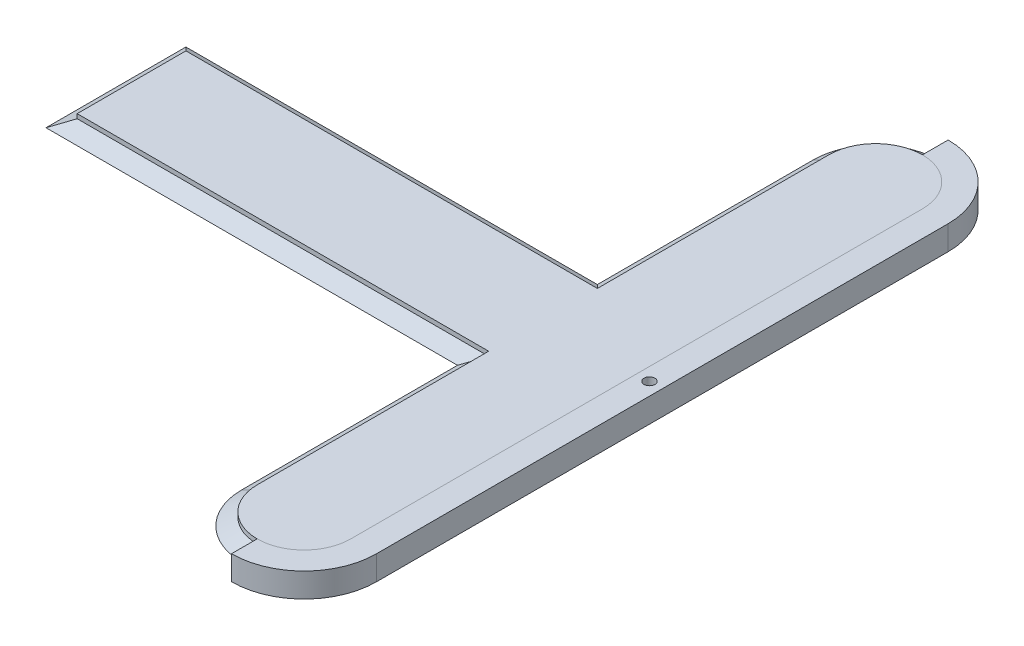
ISO-10303-21;
HEADER;
FILE_DESCRIPTION(('STEP AP214'),'2;1');
FILE_NAME('part.step','',(''),(''),'','','');
FILE_SCHEMA(('AUTOMOTIVE_DESIGN { 1 0 10303 214 1 1 1 1 }'));
ENDSEC;
DATA;
#1=APPLICATION_CONTEXT('core data for automotive mechanical design processes');
#2=APPLICATION_PROTOCOL_DEFINITION('international standard','automotive_design',2000,#1);
#3=PRODUCT_CONTEXT('',#1,'mechanical');
#4=PRODUCT('Part','Part','',(#3));
#5=PRODUCT_RELATED_PRODUCT_CATEGORY('part','',(#4));
#6=PRODUCT_DEFINITION_FORMATION('','',#4);
#7=PRODUCT_DEFINITION_CONTEXT('part definition',#1,'design');
#8=PRODUCT_DEFINITION('design','',#6,#7);
#9=PRODUCT_DEFINITION_SHAPE('','',#8);
#10=(LENGTH_UNIT() NAMED_UNIT(*) SI_UNIT(.MILLI.,.METRE.));
#11=(NAMED_UNIT(*) PLANE_ANGLE_UNIT() SI_UNIT($,.RADIAN.));
#12=(NAMED_UNIT(*) SI_UNIT($,.STERADIAN.) SOLID_ANGLE_UNIT());
#13=UNCERTAINTY_MEASURE_WITH_UNIT(LENGTH_MEASURE(1.E-05),#10,'distance_accuracy_value','');
#14=(GEOMETRIC_REPRESENTATION_CONTEXT(3) GLOBAL_UNCERTAINTY_ASSIGNED_CONTEXT((#13)) GLOBAL_UNIT_ASSIGNED_CONTEXT((#10,
#11,#12)) REPRESENTATION_CONTEXT('',''));
#15=CARTESIAN_POINT('',(0.,0.,0.));
#16=DIRECTION('',(0.,0.,1.));
#17=DIRECTION('',(1.,0.,0.));
#18=AXIS2_PLACEMENT_3D('',#15,#16,#17);
#19=CARTESIAN_POINT('',(113.157,-177.860840145929,70.5715536280061));
#20=DIRECTION('',(0.,1.,0.));
#21=DIRECTION('',(0.,0.,1.));
#22=AXIS2_PLACEMENT_3D('',#19,#20,#21);
#23=CYLINDRICAL_SURFACE('',#22,17.9070000000001);
#24=CARTESIAN_POINT('',(113.157,0.,70.5715536280061));
#25=DIRECTION('',(0.,1.,0.));
#26=DIRECTION('',(0.,0.,1.));
#27=AXIS2_PLACEMENT_3D('',#24,#25,#26);
#28=CIRCLE('',#27,17.9070000000001);
#29=CARTESIAN_POINT('',(131.064,0.,70.5715536280061));
#30=VERTEX_POINT('',#29);
#31=CARTESIAN_POINT('',(113.157,0.,88.4785536280062));
#32=VERTEX_POINT('',#31);
#33=EDGE_CURVE('E64',#30,#32,#28,.F.);
#34=ORIENTED_EDGE('',*,*,#33,.F.);
#35=DIRECTION('',(0.,1.,0.));
#36=VECTOR('',#35,1.);
#37=CARTESIAN_POINT('',(131.064,-177.860840145929,70.5715536280061));
#38=LINE('',#37,#36);
#39=CARTESIAN_POINT('',(131.064,6.,70.5715536280061));
#40=VERTEX_POINT('',#39);
#41=EDGE_CURVE('E138',#30,#40,#38,.T.);
#42=ORIENTED_EDGE('',*,*,#41,.T.);
#43=CARTESIAN_POINT('',(113.157,6.,70.5715536280061));
#44=DIRECTION('',(0.,1.,0.));
#45=DIRECTION('',(0.,0.,1.));
#46=AXIS2_PLACEMENT_3D('',#43,#44,#45);
#47=CIRCLE('',#46,17.9070000000001);
#48=CARTESIAN_POINT('',(113.157,6.,88.4785536280062));
#49=VERTEX_POINT('',#48);
#50=EDGE_CURVE('E167',#49,#40,#47,.T.);
#51=ORIENTED_EDGE('',*,*,#50,.F.);
#52=DIRECTION('',(0.,1.,0.));
#53=VECTOR('',#52,1.);
#54=CARTESIAN_POINT('',(113.157,-177.860840145929,88.4785536280062));
#55=LINE('',#54,#53);
#56=EDGE_CURVE('E124',#32,#49,#55,.T.);
#57=ORIENTED_EDGE('',*,*,#56,.F.);
#58=EDGE_LOOP('',(#34,#42,#51,#57));
#59=FACE_BOUND('',#58,.T.);
#60=ADVANCED_FACE('F56',(#59),#23,.T.);
#61=CARTESIAN_POINT('',(113.157,-177.860840145929,82.1285536280061));
#62=DIRECTION('',(-1.,0.,0.));
#63=DIRECTION('',(0.,0.,1.));
#64=AXIS2_PLACEMENT_3D('',#61,#62,#63);
#65=PLANE('',#64);
#66=DIRECTION('',(0.,0.,-1.));
#67=VECTOR('',#66,1.);
#68=CARTESIAN_POINT('',(113.157,0.,82.1285536280061));
#69=LINE('',#68,#67);
#70=CARTESIAN_POINT('',(113.157,0.,82.1285536280061));
#71=VERTEX_POINT('',#70);
#72=EDGE_CURVE('E101',#32,#71,#69,.T.);
#73=ORIENTED_EDGE('',*,*,#72,.F.);
#74=ORIENTED_EDGE('',*,*,#56,.T.);
#75=DIRECTION('',(0.,0.,1.));
#76=VECTOR('',#75,1.);
#77=CARTESIAN_POINT('',(113.157,6.,82.1285536280061));
#78=LINE('',#77,#76);
#79=CARTESIAN_POINT('',(113.157,6.,82.1285536280061));
#80=VERTEX_POINT('',#79);
#81=EDGE_CURVE('E140',#80,#49,#78,.T.);
#82=ORIENTED_EDGE('',*,*,#81,.F.);
#83=DIRECTION('',(0.,1.,0.));
#84=VECTOR('',#83,1.);
#85=CARTESIAN_POINT('',(113.157,-177.860840145929,82.1285536280061));
#86=LINE('',#85,#84);
#87=EDGE_CURVE('E122',#71,#80,#86,.T.);
#88=ORIENTED_EDGE('',*,*,#87,.F.);
#89=EDGE_LOOP('',(#73,#74,#82,#88));
#90=FACE_BOUND('',#89,.T.);
#91=ADVANCED_FACE('F192',(#90),#65,.T.);
#92=CARTESIAN_POINT('',(113.157,-177.860840145929,70.5715536280061));
#93=DIRECTION('',(0.,1.,0.));
#94=DIRECTION('',(0.,0.,1.));
#95=AXIS2_PLACEMENT_3D('',#92,#93,#94);
#96=CYLINDRICAL_SURFACE('',#95,11.557);
#97=CARTESIAN_POINT('',(113.157,0.,70.5715536280061));
#98=DIRECTION('',(0.,1.,0.));
#99=DIRECTION('',(0.,0.,1.));
#100=AXIS2_PLACEMENT_3D('',#97,#98,#99);
#101=CIRCLE('',#100,11.557);
#102=CARTESIAN_POINT('',(124.714,0.,70.5715536280061));
#103=VERTEX_POINT('',#102);
#104=EDGE_CURVE('E97',#71,#103,#101,.T.);
#105=ORIENTED_EDGE('',*,*,#104,.F.);
#106=ORIENTED_EDGE('',*,*,#87,.T.);
#107=CARTESIAN_POINT('',(113.157,6.,70.5715536280061));
#108=DIRECTION('',(0.,-1.,0.));
#109=DIRECTION('',(0.,0.,1.));
#110=AXIS2_PLACEMENT_3D('',#107,#108,#109);
#111=CIRCLE('',#110,11.557);
#112=CARTESIAN_POINT('',(124.714,6.,70.5715536280061));
#113=VERTEX_POINT('',#112);
#114=EDGE_CURVE('E120',#113,#80,#111,.T.);
#115=ORIENTED_EDGE('',*,*,#114,.F.);
#116=DIRECTION('',(0.,1.,0.));
#117=VECTOR('',#116,1.);
#118=CARTESIAN_POINT('',(124.714,-177.860840145929,70.5715536280061));
#119=LINE('',#118,#117);
#120=EDGE_CURVE('E113',#103,#113,#119,.T.);
#121=ORIENTED_EDGE('',*,*,#120,.F.);
#122=EDGE_LOOP('',(#105,#106,#115,#121));
#123=FACE_BOUND('',#122,.T.);
#124=ADVANCED_FACE('F118',(#123),#96,.F.);
#125=CARTESIAN_POINT('',(124.714,-177.860840145929,-70.571553628006));
#126=DIRECTION('',(-1.,0.,0.));
#127=DIRECTION('',(0.,0.,1.));
#128=AXIS2_PLACEMENT_3D('',#125,#126,#127);
#129=PLANE('',#128);
#130=DIRECTION('',(0.,0.,-1.));
#131=VECTOR('',#130,1.);
#132=CARTESIAN_POINT('',(124.714,0.,-70.571553628006));
#133=LINE('',#132,#131);
#134=CARTESIAN_POINT('',(124.714,0.,-70.571553628006));
#135=VERTEX_POINT('',#134);
#136=EDGE_CURVE('E100',#103,#135,#133,.T.);
#137=ORIENTED_EDGE('',*,*,#136,.F.);
#138=ORIENTED_EDGE('',*,*,#120,.T.);
#139=DIRECTION('',(0.,0.,1.));
#140=VECTOR('',#139,1.);
#141=CARTESIAN_POINT('',(124.714,6.,-70.571553628006));
#142=LINE('',#141,#140);
#143=CARTESIAN_POINT('',(124.714,6.,-70.571553628006));
#144=VERTEX_POINT('',#143);
#145=EDGE_CURVE('E151',#144,#113,#142,.T.);
#146=ORIENTED_EDGE('',*,*,#145,.F.);
#147=DIRECTION('',(0.,1.,0.));
#148=VECTOR('',#147,1.);
#149=CARTESIAN_POINT('',(124.714,-177.860840145929,-70.571553628006));
#150=LINE('',#149,#148);
#151=EDGE_CURVE('E116',#135,#144,#150,.T.);
#152=ORIENTED_EDGE('',*,*,#151,.F.);
#153=EDGE_LOOP('',(#137,#138,#146,#152));
#154=FACE_BOUND('',#153,.T.);
#155=ADVANCED_FACE('F110',(#154),#129,.T.);
#156=CARTESIAN_POINT('',(113.157,-177.860840145929,-70.571553628006));
#157=DIRECTION('',(0.,1.,0.));
#158=DIRECTION('',(0.,0.,1.));
#159=AXIS2_PLACEMENT_3D('',#156,#157,#158);
#160=CYLINDRICAL_SURFACE('',#159,11.557);
#161=CARTESIAN_POINT('',(113.157,0.,-70.571553628006));
#162=DIRECTION('',(0.,1.,0.));
#163=DIRECTION('',(0.,0.,1.));
#164=AXIS2_PLACEMENT_3D('',#161,#162,#163);
#165=CIRCLE('',#164,11.557);
#166=CARTESIAN_POINT('',(113.157,0.,-82.1285536280061));
#167=VERTEX_POINT('',#166);
#168=EDGE_CURVE('E77',#135,#167,#165,.T.);
#169=ORIENTED_EDGE('',*,*,#168,.F.);
#170=ORIENTED_EDGE('',*,*,#151,.T.);
#171=CARTESIAN_POINT('',(113.157,6.,-70.571553628006));
#172=DIRECTION('',(0.,-1.,0.));
#173=DIRECTION('',(0.,0.,1.));
#174=AXIS2_PLACEMENT_3D('',#171,#172,#173);
#175=CIRCLE('',#174,11.557);
#176=CARTESIAN_POINT('',(113.157,6.,-82.1285536280061));
#177=VERTEX_POINT('',#176);
#178=EDGE_CURVE('E178',#177,#144,#175,.T.);
#179=ORIENTED_EDGE('',*,*,#178,.F.);
#180=DIRECTION('',(0.,1.,0.));
#181=VECTOR('',#180,1.);
#182=CARTESIAN_POINT('',(113.157,-177.860840145929,-82.1285536280061));
#183=LINE('',#182,#181);
#184=EDGE_CURVE('E126',#167,#177,#183,.T.);
#185=ORIENTED_EDGE('',*,*,#184,.F.);
#186=EDGE_LOOP('',(#169,#170,#179,#185));
#187=FACE_BOUND('',#186,.T.);
#188=ADVANCED_FACE('F204',(#187),#160,.F.);
#189=CARTESIAN_POINT('',(113.157,-177.860840145929,-88.4785536280061));
#190=DIRECTION('',(-1.,0.,0.));
#191=DIRECTION('',(0.,0.,1.));
#192=AXIS2_PLACEMENT_3D('',#189,#190,#191);
#193=PLANE('',#192);
#194=DIRECTION('',(0.,0.,-1.));
#195=VECTOR('',#194,1.);
#196=CARTESIAN_POINT('',(113.157,0.,-88.4785536280061));
#197=LINE('',#196,#195);
#198=CARTESIAN_POINT('',(113.157,0.,-88.4785536280061));
#199=VERTEX_POINT('',#198);
#200=EDGE_CURVE('E71',#167,#199,#197,.T.);
#201=ORIENTED_EDGE('',*,*,#200,.F.);
#202=ORIENTED_EDGE('',*,*,#184,.T.);
#203=DIRECTION('',(0.,0.,1.));
#204=VECTOR('',#203,1.);
#205=CARTESIAN_POINT('',(113.157,6.,-88.4785536280061));
#206=LINE('',#205,#204);
#207=CARTESIAN_POINT('',(113.157,6.,-88.4785536280061));
#208=VERTEX_POINT('',#207);
#209=EDGE_CURVE('E175',#208,#177,#206,.T.);
#210=ORIENTED_EDGE('',*,*,#209,.F.);
#211=DIRECTION('',(0.,1.,0.));
#212=VECTOR('',#211,1.);
#213=CARTESIAN_POINT('',(113.157,-177.860840145929,-88.4785536280061));
#214=LINE('',#213,#212);
#215=EDGE_CURVE('E132',#199,#208,#214,.T.);
#216=ORIENTED_EDGE('',*,*,#215,.F.);
#217=EDGE_LOOP('',(#201,#202,#210,#216));
#218=FACE_BOUND('',#217,.T.);
#219=ADVANCED_FACE('F202',(#218),#193,.T.);
#220=CARTESIAN_POINT('',(113.157,-177.860840145929,-70.571553628006));
#221=DIRECTION('',(0.,1.,0.));
#222=DIRECTION('',(0.,0.,1.));
#223=AXIS2_PLACEMENT_3D('',#220,#221,#222);
#224=CYLINDRICAL_SURFACE('',#223,17.9070000000001);
#225=CARTESIAN_POINT('',(113.157,0.,-70.571553628006));
#226=DIRECTION('',(0.,1.,0.));
#227=DIRECTION('',(0.,0.,1.));
#228=AXIS2_PLACEMENT_3D('',#225,#226,#227);
#229=CIRCLE('',#228,17.9070000000001);
#230=CARTESIAN_POINT('',(131.064,0.,-70.571553628006));
#231=VERTEX_POINT('',#230);
#232=EDGE_CURVE('E155',#199,#231,#229,.F.);
#233=ORIENTED_EDGE('',*,*,#232,.F.);
#234=ORIENTED_EDGE('',*,*,#215,.T.);
#235=CARTESIAN_POINT('',(113.157,6.,-70.571553628006));
#236=DIRECTION('',(0.,1.,0.));
#237=DIRECTION('',(0.,0.,1.));
#238=AXIS2_PLACEMENT_3D('',#235,#236,#237);
#239=CIRCLE('',#238,17.9070000000001);
#240=CARTESIAN_POINT('',(131.064,6.,-70.571553628006));
#241=VERTEX_POINT('',#240);
#242=EDGE_CURVE('E172',#241,#208,#239,.T.);
#243=ORIENTED_EDGE('',*,*,#242,.F.);
#244=DIRECTION('',(0.,1.,0.));
#245=VECTOR('',#244,1.);
#246=CARTESIAN_POINT('',(131.064,-177.860840145929,-70.571553628006));
#247=LINE('',#246,#245);
#248=EDGE_CURVE('E135',#231,#241,#247,.T.);
#249=ORIENTED_EDGE('',*,*,#248,.F.);
#250=EDGE_LOOP('',(#233,#234,#243,#249));
#251=FACE_BOUND('',#250,.T.);
#252=ADVANCED_FACE('F200',(#251),#224,.T.);
#253=CARTESIAN_POINT('',(131.064,-177.860840145929,70.5715536280061));
#254=DIRECTION('',(1.,0.,0.));
#255=DIRECTION('',(0.,0.,-1.));
#256=AXIS2_PLACEMENT_3D('',#253,#254,#255);
#257=PLANE('',#256);
#258=DIRECTION('',(0.,0.,1.));
#259=VECTOR('',#258,1.);
#260=CARTESIAN_POINT('',(131.064,0.,70.5715536280061));
#261=LINE('',#260,#259);
#262=EDGE_CURVE('E12',#231,#30,#261,.T.);
#263=ORIENTED_EDGE('',*,*,#262,.F.);
#264=ORIENTED_EDGE('',*,*,#248,.T.);
#265=DIRECTION('',(0.,0.,-1.));
#266=VECTOR('',#265,1.);
#267=CARTESIAN_POINT('',(131.064,6.,70.5715536280061));
#268=LINE('',#267,#266);
#269=EDGE_CURVE('E169',#40,#241,#268,.T.);
#270=ORIENTED_EDGE('',*,*,#269,.F.);
#271=ORIENTED_EDGE('',*,*,#41,.F.);
#272=EDGE_LOOP('',(#263,#264,#270,#271));
#273=FACE_BOUND('',#272,.T.);
#274=ADVANCED_FACE('F225',(#273),#257,.T.);
#275=CARTESIAN_POINT('',(113.157,6.,70.5715536280061));
#276=DIRECTION('',(0.,1.,0.));
#277=DIRECTION('',(0.,0.,1.));
#278=AXIS2_PLACEMENT_3D('',#275,#276,#277);
#279=PLANE('',#278);
#280=CARTESIAN_POINT('',(127.889,6.,0.));
#281=DIRECTION('',(0.,1.,0.));
#282=DIRECTION('',(0.,0.,1.));
#283=AXIS2_PLACEMENT_3D('',#280,#281,#282);
#284=CIRCLE('',#283,1.34999999999998);
#285=CARTESIAN_POINT('',(127.889,6.,1.34999999999999));
#286=VERTEX_POINT('',#285);
#287=EDGE_CURVE('E162',#286,#286,#284,.T.);
#288=ORIENTED_EDGE('',*,*,#287,.F.);
#289=EDGE_LOOP('',(#288));
#290=FACE_BOUND('',#289,.T.);
#291=ORIENTED_EDGE('',*,*,#50,.T.);
#292=ORIENTED_EDGE('',*,*,#269,.T.);
#293=ORIENTED_EDGE('',*,*,#242,.T.);
#294=ORIENTED_EDGE('',*,*,#209,.T.);
#295=ORIENTED_EDGE('',*,*,#178,.T.);
#296=ORIENTED_EDGE('',*,*,#145,.T.);
#297=ORIENTED_EDGE('',*,*,#114,.T.);
#298=ORIENTED_EDGE('',*,*,#81,.T.);
#299=EDGE_LOOP('',(#291,#292,#293,#294,#295,#296,#297,#298));
#300=FACE_BOUND('',#299,.T.);
#301=ADVANCED_FACE('F180',(#290,#300),#279,.T.);
#302=CARTESIAN_POINT('',(113.157,0.,70.5715536280061));
#303=DIRECTION('',(0.,1.,0.));
#304=DIRECTION('',(0.,0.,1.));
#305=AXIS2_PLACEMENT_3D('',#302,#303,#304);
#306=PLANE('',#305);
#307=CARTESIAN_POINT('',(127.889,0.,0.));
#308=DIRECTION('',(0.,1.,0.));
#309=DIRECTION('',(0.,0.,1.));
#310=AXIS2_PLACEMENT_3D('',#307,#308,#309);
#311=CIRCLE('',#310,1.34999999999998);
#312=CARTESIAN_POINT('',(127.889,0.,1.34999999999999));
#313=VERTEX_POINT('',#312);
#314=EDGE_CURVE('E59',#313,#313,#311,.T.);
#315=ORIENTED_EDGE('',*,*,#314,.T.);
#316=EDGE_LOOP('',(#315));
#317=FACE_BOUND('',#316,.T.);
#318=ORIENTED_EDGE('',*,*,#33,.T.);
#319=ORIENTED_EDGE('',*,*,#72,.T.);
#320=ORIENTED_EDGE('',*,*,#104,.T.);
#321=ORIENTED_EDGE('',*,*,#136,.T.);
#322=ORIENTED_EDGE('',*,*,#168,.T.);
#323=ORIENTED_EDGE('',*,*,#200,.T.);
#324=ORIENTED_EDGE('',*,*,#232,.T.);
#325=ORIENTED_EDGE('',*,*,#262,.T.);
#326=EDGE_LOOP('',(#318,#319,#320,#321,#322,#323,#324,#325));
#327=FACE_BOUND('',#326,.T.);
#328=ADVANCED_FACE('F99',(#317,#327),#306,.F.);
#329=CARTESIAN_POINT('',(127.889,-11.78,0.));
#330=DIRECTION('',(0.,1.,0.));
#331=DIRECTION('',(0.,0.,1.));
#332=AXIS2_PLACEMENT_3D('',#329,#330,#331);
#333=CYLINDRICAL_SURFACE('',#332,1.34999999999998);
#334=ORIENTED_EDGE('',*,*,#287,.T.);
#335=EDGE_LOOP('',(#334));
#336=FACE_BOUND('',#335,.T.);
#337=ORIENTED_EDGE('',*,*,#314,.F.);
#338=EDGE_LOOP('',(#337));
#339=FACE_BOUND('',#338,.T.);
#340=ADVANCED_FACE('F229',(#336,#339),#333,.F.);
#341=CLOSED_SHELL('',(#60,#91,#124,#155,#188,#219,#252,#274,#301,#328,#340));
#342=MANIFOLD_SOLID_BREP('B2',#341);
#343=CARTESIAN_POINT('',(0.,6.,-13.4215536280061));
#344=DIRECTION('',(1.,0.,0.));
#345=DIRECTION('',(0.,0.,-1.));
#346=AXIS2_PLACEMENT_3D('',#343,#344,#345);
#347=PLANE('',#346);
#348=DIRECTION('',(0.,0.,-1.));
#349=VECTOR('',#348,1.);
#350=CARTESIAN_POINT('',(0.,4.91034304153466,17.7565536280061));
#351=LINE('',#350,#349);
#352=CARTESIAN_POINT('',(0.,4.91034304153466,13.4215536280061));
#353=VERTEX_POINT('',#352);
#354=CARTESIAN_POINT('',(0.,4.91034304153466,-13.4215536280061));
#355=VERTEX_POINT('',#354);
#356=EDGE_CURVE('E517',#353,#355,#351,.T.);
#357=ORIENTED_EDGE('',*,*,#356,.F.);
#358=DIRECTION('',(0.,-1.,0.));
#359=VECTOR('',#358,1.);
#360=CARTESIAN_POINT('',(0.,6.,13.4215536280061));
#361=LINE('',#360,#359);
#362=CARTESIAN_POINT('',(0.,6.,13.4215536280061));
#363=VERTEX_POINT('',#362);
#364=EDGE_CURVE('E678',#363,#353,#361,.T.);
#365=ORIENTED_EDGE('',*,*,#364,.F.);
#366=DIRECTION('',(0.,0.,1.));
#367=VECTOR('',#366,1.);
#368=CARTESIAN_POINT('',(0.,6.,-13.4215536280061));
#369=LINE('',#368,#367);
#370=CARTESIAN_POINT('',(0.,6.,-13.4215536280061));
#371=VERTEX_POINT('',#370);
#372=EDGE_CURVE('E586',#371,#363,#369,.T.);
#373=ORIENTED_EDGE('',*,*,#372,.F.);
#374=DIRECTION('',(0.,-1.,0.));
#375=VECTOR('',#374,1.);
#376=CARTESIAN_POINT('',(0.,6.,-13.4215536280061));
#377=LINE('',#376,#375);
#378=EDGE_CURVE('E645',#371,#355,#377,.T.);
#379=ORIENTED_EDGE('',*,*,#378,.T.);
#380=EDGE_LOOP('',(#357,#365,#373,#379));
#381=FACE_BOUND('',#380,.T.);
#382=ADVANCED_FACE('F304',(#381),#347,.F.);
#383=CARTESIAN_POINT('',(101.6,6.,-70.5715536280061));
#384=DIRECTION('',(1.,0.,0.));
#385=DIRECTION('',(0.,0.,-1.));
#386=AXIS2_PLACEMENT_3D('',#383,#384,#385);
#387=PLANE('',#386);
#388=DIRECTION('',(0.,0.,-1.));
#389=VECTOR('',#388,1.);
#390=CARTESIAN_POINT('',(101.6,4.91034304153466,-13.4215536280061));
#391=LINE('',#390,#389);
#392=CARTESIAN_POINT('',(101.6,4.91034304153466,-13.4215536280061));
#393=VERTEX_POINT('',#392);
#394=CARTESIAN_POINT('',(101.6,4.91034304153466,-70.5715536280061));
#395=VERTEX_POINT('',#394);
#396=EDGE_CURVE('E560',#393,#395,#391,.T.);
#397=ORIENTED_EDGE('',*,*,#396,.F.);
#398=DIRECTION('',(0.,-1.,0.));
#399=VECTOR('',#398,1.);
#400=CARTESIAN_POINT('',(101.6,6.,-13.4215536280061));
#401=LINE('',#400,#399);
#402=CARTESIAN_POINT('',(101.6,6.,-13.4215536280061));
#403=VERTEX_POINT('',#402);
#404=EDGE_CURVE('E650',#403,#393,#401,.T.);
#405=ORIENTED_EDGE('',*,*,#404,.F.);
#406=DIRECTION('',(0.,0.,1.));
#407=VECTOR('',#406,1.);
#408=CARTESIAN_POINT('',(101.6,6.,-70.5715536280061));
#409=LINE('',#408,#407);
#410=CARTESIAN_POINT('',(101.6,6.,-70.5715536280061));
#411=VERTEX_POINT('',#410);
#412=EDGE_CURVE('E606',#411,#403,#409,.T.);
#413=ORIENTED_EDGE('',*,*,#412,.F.);
#414=DIRECTION('',(0.,-1.,0.));
#415=VECTOR('',#414,1.);
#416=CARTESIAN_POINT('',(101.6,6.,-70.5715536280061));
#417=LINE('',#416,#415);
#418=EDGE_CURVE('E654',#411,#395,#417,.T.);
#419=ORIENTED_EDGE('',*,*,#418,.T.);
#420=EDGE_LOOP('',(#397,#405,#413,#419));
#421=FACE_BOUND('',#420,.T.);
#422=ADVANCED_FACE('F783',(#421),#387,.F.);
#423=CARTESIAN_POINT('',(113.157,6.,-70.5715536280061));
#424=DIRECTION('',(0.,-1.,0.));
#425=DIRECTION('',(0.,0.,-1.));
#426=AXIS2_PLACEMENT_3D('',#423,#424,#425);
#427=CYLINDRICAL_SURFACE('',#426,11.557);
#428=DIRECTION('',(0.,-1.,0.));
#429=VECTOR('',#428,1.);
#430=CARTESIAN_POINT('',(113.157,4.91034304153466,-82.1285536280061));
#431=LINE('',#430,#429);
#432=CARTESIAN_POINT('',(113.157,4.91034304153466,-82.1285536280061));
#433=VERTEX_POINT('',#432);
#434=CARTESIAN_POINT('',(113.157,3.,-82.1285536280061));
#435=VERTEX_POINT('',#434);
#436=EDGE_CURVE('E323',#433,#435,#431,.T.);
#437=ORIENTED_EDGE('',*,*,#436,.F.);
#438=CARTESIAN_POINT('',(113.157,4.91034304153466,-70.5715536280061));
#439=DIRECTION('',(0.,-1.,0.));
#440=DIRECTION('',(-1.,0.,0.));
#441=AXIS2_PLACEMENT_3D('',#438,#439,#440);
#442=CIRCLE('',#441,11.557);
#443=EDGE_CURVE('E328',#395,#433,#442,.T.);
#444=ORIENTED_EDGE('',*,*,#443,.F.);
#445=ORIENTED_EDGE('',*,*,#418,.F.);
#446=CARTESIAN_POINT('',(113.157,6.,-70.5715536280061));
#447=DIRECTION('',(0.,1.,0.));
#448=DIRECTION('',(0.,0.,1.));
#449=AXIS2_PLACEMENT_3D('',#446,#447,#448);
#450=CIRCLE('',#449,11.557);
#451=CARTESIAN_POINT('',(124.714,6.,-70.5715536280061));
#452=VERTEX_POINT('',#451);
#453=EDGE_CURVE('E603',#452,#411,#450,.T.);
#454=ORIENTED_EDGE('',*,*,#453,.F.);
#455=DIRECTION('',(0.,-1.,0.));
#456=VECTOR('',#455,1.);
#457=CARTESIAN_POINT('',(124.714,6.,-70.5715536280061));
#458=LINE('',#457,#456);
#459=CARTESIAN_POINT('',(124.714,3.,-70.5715536280061));
#460=VERTEX_POINT('',#459);
#461=EDGE_CURVE('E658',#452,#460,#458,.T.);
#462=ORIENTED_EDGE('',*,*,#461,.T.);
#463=CARTESIAN_POINT('',(113.157,3.,-70.5715536280061));
#464=DIRECTION('',(0.,-1.,0.));
#465=DIRECTION('',(0.,0.,-1.));
#466=AXIS2_PLACEMENT_3D('',#463,#464,#465);
#467=CIRCLE('',#466,11.557);
#468=EDGE_CURVE('E314',#435,#460,#467,.T.);
#469=ORIENTED_EDGE('',*,*,#468,.F.);
#470=EDGE_LOOP('',(#437,#444,#445,#454,#462,#469));
#471=FACE_BOUND('',#470,.T.);
#472=ADVANCED_FACE('F814',(#471),#427,.T.);
#473=CARTESIAN_POINT('',(101.6,6.,13.4215536280061));
#474=DIRECTION('',(1.,0.,0.));
#475=DIRECTION('',(0.,0.,-1.));
#476=AXIS2_PLACEMENT_3D('',#473,#474,#475);
#477=PLANE('',#476);
#478=DIRECTION('',(0.,0.,-1.));
#479=VECTOR('',#478,1.);
#480=CARTESIAN_POINT('',(101.6,4.91034304153466,70.5715536280061));
#481=LINE('',#480,#479);
#482=CARTESIAN_POINT('',(101.6,4.91034304153468,70.5715536280061));
#483=VERTEX_POINT('',#482);
#484=CARTESIAN_POINT('',(101.6,4.91034304153468,13.4215536280061));
#485=VERTEX_POINT('',#484);
#486=EDGE_CURVE('E468',#483,#485,#481,.T.);
#487=ORIENTED_EDGE('',*,*,#486,.F.);
#488=DIRECTION('',(0.,-1.,0.));
#489=VECTOR('',#488,1.);
#490=CARTESIAN_POINT('',(101.6,6.,70.5715536280061));
#491=LINE('',#490,#489);
#492=CARTESIAN_POINT('',(101.6,6.,70.5715536280061));
#493=VERTEX_POINT('',#492);
#494=EDGE_CURVE('E668',#493,#483,#491,.T.);
#495=ORIENTED_EDGE('',*,*,#494,.F.);
#496=DIRECTION('',(0.,0.,1.));
#497=VECTOR('',#496,1.);
#498=CARTESIAN_POINT('',(101.6,6.,13.4215536280061));
#499=LINE('',#498,#497);
#500=CARTESIAN_POINT('',(101.6,6.,13.4215536280061));
#501=VERTEX_POINT('',#500);
#502=EDGE_CURVE('E594',#501,#493,#499,.T.);
#503=ORIENTED_EDGE('',*,*,#502,.F.);
#504=DIRECTION('',(0.,-1.,0.));
#505=VECTOR('',#504,1.);
#506=CARTESIAN_POINT('',(101.6,6.,13.4215536280061));
#507=LINE('',#506,#505);
#508=EDGE_CURVE('E673',#501,#485,#507,.T.);
#509=ORIENTED_EDGE('',*,*,#508,.T.);
#510=EDGE_LOOP('',(#487,#495,#503,#509));
#511=FACE_BOUND('',#510,.T.);
#512=ADVANCED_FACE('F733',(#511),#477,.F.);
#513=CARTESIAN_POINT('',(113.157,6.,70.5715536280061));
#514=DIRECTION('',(0.,-1.,0.));
#515=DIRECTION('',(0.,0.,-1.));
#516=AXIS2_PLACEMENT_3D('',#513,#514,#515);
#517=CYLINDRICAL_SURFACE('',#516,11.557);
#518=CARTESIAN_POINT('',(113.157,4.91034304153466,70.5715536280061));
#519=DIRECTION('',(0.,-1.,0.));
#520=DIRECTION('',(0.,0.,1.));
#521=AXIS2_PLACEMENT_3D('',#518,#519,#520);
#522=CIRCLE('',#521,11.5570000000001);
#523=CARTESIAN_POINT('',(113.157,4.91034304153468,82.1285536280061));
#524=VERTEX_POINT('',#523);
#525=EDGE_CURVE('E499',#524,#483,#522,.T.);
#526=ORIENTED_EDGE('',*,*,#525,.F.);
#527=DIRECTION('',(0.,-1.,0.));
#528=VECTOR('',#527,1.);
#529=CARTESIAN_POINT('',(113.157,4.91034304153466,82.1285536280061));
#530=LINE('',#529,#528);
#531=CARTESIAN_POINT('',(113.157,3.,82.1285536280061));
#532=VERTEX_POINT('',#531);
#533=EDGE_CURVE('E316',#524,#532,#530,.T.);
#534=ORIENTED_EDGE('',*,*,#533,.T.);
#535=CARTESIAN_POINT('',(113.157,3.,70.5715536280061));
#536=DIRECTION('',(0.,-1.,0.));
#537=DIRECTION('',(0.,0.,-1.));
#538=AXIS2_PLACEMENT_3D('',#535,#536,#537);
#539=CIRCLE('',#538,11.557);
#540=CARTESIAN_POINT('',(124.714,3.,70.5715536280061));
#541=VERTEX_POINT('',#540);
#542=EDGE_CURVE('E308',#541,#532,#539,.T.);
#543=ORIENTED_EDGE('',*,*,#542,.F.);
#544=DIRECTION('',(0.,-1.,0.));
#545=VECTOR('',#544,1.);
#546=CARTESIAN_POINT('',(124.714,6.,70.5715536280061));
#547=LINE('',#546,#545);
#548=CARTESIAN_POINT('',(124.714,6.,70.5715536280061));
#549=VERTEX_POINT('',#548);
#550=EDGE_CURVE('E663',#549,#541,#547,.T.);
#551=ORIENTED_EDGE('',*,*,#550,.F.);
#552=CARTESIAN_POINT('',(113.157,6.,70.5715536280061));
#553=DIRECTION('',(0.,1.,0.));
#554=DIRECTION('',(0.,0.,1.));
#555=AXIS2_PLACEMENT_3D('',#552,#553,#554);
#556=CIRCLE('',#555,11.557);
#557=EDGE_CURVE('E597',#493,#549,#556,.T.);
#558=ORIENTED_EDGE('',*,*,#557,.F.);
#559=ORIENTED_EDGE('',*,*,#494,.T.);
#560=EDGE_LOOP('',(#526,#534,#543,#551,#558,#559));
#561=FACE_BOUND('',#560,.T.);
#562=ADVANCED_FACE('F728',(#561),#517,.T.);
#563=CARTESIAN_POINT('',(0.,6.,13.4215536280061));
#564=DIRECTION('',(0.,0.,-1.));
#565=DIRECTION('',(-1.,0.,0.));
#566=AXIS2_PLACEMENT_3D('',#563,#564,#565);
#567=PLANE('',#566);
#568=DIRECTION('',(-1.,0.,0.));
#569=VECTOR('',#568,1.);
#570=CARTESIAN_POINT('',(101.6,4.91034304153466,13.4215536280061));
#571=LINE('',#570,#569);
#572=EDGE_CURVE('E481',#485,#353,#571,.T.);
#573=ORIENTED_EDGE('',*,*,#572,.F.);
#574=ORIENTED_EDGE('',*,*,#508,.F.);
#575=DIRECTION('',(1.,0.,0.));
#576=VECTOR('',#575,1.);
#577=CARTESIAN_POINT('',(0.,6.,13.4215536280061));
#578=LINE('',#577,#576);
#579=EDGE_CURVE('E590',#363,#501,#578,.T.);
#580=ORIENTED_EDGE('',*,*,#579,.F.);
#581=ORIENTED_EDGE('',*,*,#364,.T.);
#582=EDGE_LOOP('',(#573,#574,#580,#581));
#583=FACE_BOUND('',#582,.T.);
#584=ADVANCED_FACE('F736',(#583),#567,.F.);
#585=CARTESIAN_POINT('',(113.157,1.06034304153466,-82.1285536280061));
#586=VERTEX_POINT('',#585);
#587=EDGE_CURVE('E553',#435,#586,#431,.T.);
#588=ORIENTED_EDGE('',*,*,#587,.F.);
#589=ORIENTED_EDGE('',*,*,#468,.T.);
#590=CARTESIAN_POINT('',(124.714,0.,-70.5715536280061));
#591=VERTEX_POINT('',#590);
#592=EDGE_CURVE('E657',#460,#591,#458,.T.);
#593=ORIENTED_EDGE('',*,*,#592,.T.);
#594=CARTESIAN_POINT('',(113.157,0.,-70.5715536280061));
#595=DIRECTION('',(0.,1.,0.));
#596=DIRECTION('',(0.,0.,1.));
#597=AXIS2_PLACEMENT_3D('',#594,#595,#596);
#598=CIRCLE('',#597,11.557);
#599=CARTESIAN_POINT('',(101.6,0.,-70.5715536280061));
#600=VERTEX_POINT('',#599);
#601=EDGE_CURVE('E634',#591,#600,#598,.T.);
#602=ORIENTED_EDGE('',*,*,#601,.T.);
#603=CARTESIAN_POINT('',(101.6,1.06034304153466,-70.5715536280061));
#604=VERTEX_POINT('',#603);
#605=EDGE_CURVE('E653',#604,#600,#417,.T.);
#606=ORIENTED_EDGE('',*,*,#605,.F.);
#607=CARTESIAN_POINT('',(113.157,1.06034304153466,-70.5715536280061));
#608=DIRECTION('',(0.,-1.,0.));
#609=DIRECTION('',(-1.,0.,0.));
#610=AXIS2_PLACEMENT_3D('',#607,#608,#609);
#611=CIRCLE('',#610,11.557);
#612=EDGE_CURVE('E565',#604,#586,#611,.T.);
#613=ORIENTED_EDGE('',*,*,#612,.T.);
#614=EDGE_LOOP('',(#588,#589,#593,#602,#606,#613));
#615=FACE_BOUND('',#614,.T.);
#616=ADVANCED_FACE('F793',(#615),#427,.T.);
#617=CARTESIAN_POINT('',(101.6,6.,-13.4215536280061));
#618=DIRECTION('',(0.,0.,1.));
#619=DIRECTION('',(1.,0.,0.));
#620=AXIS2_PLACEMENT_3D('',#617,#618,#619);
#621=PLANE('',#620);
#622=DIRECTION('',(1.,0.,0.));
#623=VECTOR('',#622,1.);
#624=CARTESIAN_POINT('',(-4.33500000000001,4.91034304153466,-13.4215536280061));
#625=LINE('',#624,#623);
#626=EDGE_CURVE('E522',#355,#393,#625,.T.);
#627=ORIENTED_EDGE('',*,*,#626,.F.);
#628=ORIENTED_EDGE('',*,*,#378,.F.);
#629=DIRECTION('',(-1.,0.,0.));
#630=VECTOR('',#629,1.);
#631=CARTESIAN_POINT('',(101.6,6.,-13.4215536280061));
#632=LINE('',#631,#630);
#633=EDGE_CURVE('E609',#403,#371,#632,.T.);
#634=ORIENTED_EDGE('',*,*,#633,.F.);
#635=ORIENTED_EDGE('',*,*,#404,.T.);
#636=EDGE_LOOP('',(#627,#628,#634,#635));
#637=FACE_BOUND('',#636,.T.);
#638=ADVANCED_FACE('F774',(#637),#621,.F.);
#639=CARTESIAN_POINT('',(0.,1.06034304153467,-13.4215536280061));
#640=VERTEX_POINT('',#639);
#641=CARTESIAN_POINT('',(0.,0.,-13.4215536280061));
#642=VERTEX_POINT('',#641);
#643=EDGE_CURVE('E612',#640,#642,#377,.T.);
#644=ORIENTED_EDGE('',*,*,#643,.F.);
#645=DIRECTION('',(1.,0.,0.));
#646=VECTOR('',#645,1.);
#647=CARTESIAN_POINT('',(-4.33500000000001,1.06034304153466,-13.4215536280061));
#648=LINE('',#647,#646);
#649=CARTESIAN_POINT('',(101.6,1.06034304153466,-13.4215536280061));
#650=VERTEX_POINT('',#649);
#651=EDGE_CURVE('E532',#640,#650,#648,.T.);
#652=ORIENTED_EDGE('',*,*,#651,.T.);
#653=CARTESIAN_POINT('',(101.6,0.,-13.4215536280061));
#654=VERTEX_POINT('',#653);
#655=EDGE_CURVE('E649',#650,#654,#401,.T.);
#656=ORIENTED_EDGE('',*,*,#655,.T.);
#657=DIRECTION('',(-1.,0.,0.));
#658=VECTOR('',#657,1.);
#659=CARTESIAN_POINT('',(101.6,0.,-13.4215536280061));
#660=LINE('',#659,#658);
#661=EDGE_CURVE('E591',#654,#642,#660,.T.);
#662=ORIENTED_EDGE('',*,*,#661,.T.);
#663=EDGE_LOOP('',(#644,#652,#656,#662));
#664=FACE_BOUND('',#663,.T.);
#665=ADVANCED_FACE('F752',(#664),#621,.F.);
#666=CARTESIAN_POINT('',(101.6,1.06034304153466,13.4215536280061));
#667=VERTEX_POINT('',#666);
#668=CARTESIAN_POINT('',(101.6,0.,13.4215536280061));
#669=VERTEX_POINT('',#668);
#670=EDGE_CURVE('E672',#667,#669,#507,.T.);
#671=ORIENTED_EDGE('',*,*,#670,.F.);
#672=DIRECTION('',(-1.,0.,0.));
#673=VECTOR('',#672,1.);
#674=CARTESIAN_POINT('',(101.6,1.06034304153466,13.4215536280061));
#675=LINE('',#674,#673);
#676=CARTESIAN_POINT('',(0.,1.06034304153466,13.4215536280061));
#677=VERTEX_POINT('',#676);
#678=EDGE_CURVE('E463',#667,#677,#675,.T.);
#679=ORIENTED_EDGE('',*,*,#678,.T.);
#680=CARTESIAN_POINT('',(0.,0.,13.4215536280061));
#681=VERTEX_POINT('',#680);
#682=EDGE_CURVE('E677',#677,#681,#361,.T.);
#683=ORIENTED_EDGE('',*,*,#682,.T.);
#684=DIRECTION('',(1.,0.,0.));
#685=VECTOR('',#684,1.);
#686=CARTESIAN_POINT('',(0.,0.,13.4215536280061));
#687=LINE('',#686,#685);
#688=EDGE_CURVE('E617',#681,#669,#687,.T.);
#689=ORIENTED_EDGE('',*,*,#688,.T.);
#690=EDGE_LOOP('',(#671,#679,#683,#689));
#691=FACE_BOUND('',#690,.T.);
#692=ADVANCED_FACE('F819',(#691),#567,.F.);
#693=ORIENTED_EDGE('',*,*,#682,.F.);
#694=DIRECTION('',(0.,0.,-1.));
#695=VECTOR('',#694,1.);
#696=CARTESIAN_POINT('',(0.,1.06034304153466,17.7565536280061));
#697=LINE('',#696,#695);
#698=EDGE_CURVE('E526',#677,#640,#697,.T.);
#699=ORIENTED_EDGE('',*,*,#698,.T.);
#700=ORIENTED_EDGE('',*,*,#643,.T.);
#701=DIRECTION('',(0.,0.,1.));
#702=VECTOR('',#701,1.);
#703=CARTESIAN_POINT('',(0.,0.,-13.4215536280061));
#704=LINE('',#703,#702);
#705=EDGE_CURVE('E613',#642,#681,#704,.T.);
#706=ORIENTED_EDGE('',*,*,#705,.T.);
#707=EDGE_LOOP('',(#693,#699,#700,#706));
#708=FACE_BOUND('',#707,.T.);
#709=ADVANCED_FACE('F306',(#708),#347,.F.);
#710=CARTESIAN_POINT('',(101.6,1.06034304153465,70.5715536280061));
#711=VERTEX_POINT('',#710);
#712=CARTESIAN_POINT('',(101.6,0.,70.5715536280061));
#713=VERTEX_POINT('',#712);
#714=EDGE_CURVE('E667',#711,#713,#491,.T.);
#715=ORIENTED_EDGE('',*,*,#714,.F.);
#716=DIRECTION('',(0.,0.,-1.));
#717=VECTOR('',#716,1.);
#718=CARTESIAN_POINT('',(101.6,1.06034304153466,70.5715536280061));
#719=LINE('',#718,#717);
#720=EDGE_CURVE('E495',#711,#667,#719,.T.);
#721=ORIENTED_EDGE('',*,*,#720,.T.);
#722=ORIENTED_EDGE('',*,*,#670,.T.);
#723=DIRECTION('',(0.,0.,1.));
#724=VECTOR('',#723,1.);
#725=CARTESIAN_POINT('',(101.6,0.,13.4215536280061));
#726=LINE('',#725,#724);
#727=EDGE_CURVE('E622',#669,#713,#726,.T.);
#728=ORIENTED_EDGE('',*,*,#727,.T.);
#729=EDGE_LOOP('',(#715,#721,#722,#728));
#730=FACE_BOUND('',#729,.T.);
#731=ADVANCED_FACE('F818',(#730),#477,.F.);
#732=ORIENTED_EDGE('',*,*,#542,.T.);
#733=CARTESIAN_POINT('',(113.157,1.06034304153465,82.1285536280061));
#734=VERTEX_POINT('',#733);
#735=EDGE_CURVE('E54',#532,#734,#530,.T.);
#736=ORIENTED_EDGE('',*,*,#735,.T.);
#737=CARTESIAN_POINT('',(113.157,1.06034304153466,70.5715536280061));
#738=DIRECTION('',(0.,-1.,0.));
#739=DIRECTION('',(0.,0.,1.));
#740=AXIS2_PLACEMENT_3D('',#737,#738,#739);
#741=CIRCLE('',#740,11.5570000000001);
#742=EDGE_CURVE('E707',#734,#711,#741,.T.);
#743=ORIENTED_EDGE('',*,*,#742,.T.);
#744=ORIENTED_EDGE('',*,*,#714,.T.);
#745=CARTESIAN_POINT('',(113.157,0.,70.5715536280061));
#746=DIRECTION('',(0.,1.,0.));
#747=DIRECTION('',(0.,0.,1.));
#748=AXIS2_PLACEMENT_3D('',#745,#746,#747);
#749=CIRCLE('',#748,11.557);
#750=CARTESIAN_POINT('',(124.714,0.,70.5715536280061));
#751=VERTEX_POINT('',#750);
#752=EDGE_CURVE('E626',#713,#751,#749,.T.);
#753=ORIENTED_EDGE('',*,*,#752,.T.);
#754=EDGE_CURVE('E662',#541,#751,#547,.T.);
#755=ORIENTED_EDGE('',*,*,#754,.F.);
#756=EDGE_LOOP('',(#732,#736,#743,#744,#753,#755));
#757=FACE_BOUND('',#756,.T.);
#758=ADVANCED_FACE('F691',(#757),#517,.T.);
#759=CARTESIAN_POINT('',(124.714,6.,70.5715536280061));
#760=DIRECTION('',(-1.,0.,0.));
#761=DIRECTION('',(0.,0.,1.));
#762=AXIS2_PLACEMENT_3D('',#759,#760,#761);
#763=PLANE('',#762);
#764=DIRECTION('',(0.,0.,-1.));
#765=VECTOR('',#764,1.);
#766=CARTESIAN_POINT('',(124.714,0.,70.5715536280061));
#767=LINE('',#766,#765);
#768=EDGE_CURVE('E630',#751,#591,#767,.T.);
#769=ORIENTED_EDGE('',*,*,#768,.T.);
#770=ORIENTED_EDGE('',*,*,#592,.F.);
#771=ORIENTED_EDGE('',*,*,#461,.F.);
#772=DIRECTION('',(0.,0.,-1.));
#773=VECTOR('',#772,1.);
#774=CARTESIAN_POINT('',(124.714,6.,70.5715536280061));
#775=LINE('',#774,#773);
#776=EDGE_CURVE('E600',#549,#452,#775,.T.);
#777=ORIENTED_EDGE('',*,*,#776,.F.);
#778=ORIENTED_EDGE('',*,*,#550,.T.);
#779=ORIENTED_EDGE('',*,*,#754,.T.);
#780=EDGE_LOOP('',(#769,#770,#771,#777,#778,#779));
#781=FACE_BOUND('',#780,.T.);
#782=ADVANCED_FACE('F844',(#781),#763,.F.);
#783=ORIENTED_EDGE('',*,*,#655,.F.);
#784=DIRECTION('',(0.,0.,-1.));
#785=VECTOR('',#784,1.);
#786=CARTESIAN_POINT('',(101.6,1.06034304153466,-13.4215536280061));
#787=LINE('',#786,#785);
#788=EDGE_CURVE('E544',#650,#604,#787,.T.);
#789=ORIENTED_EDGE('',*,*,#788,.T.);
#790=ORIENTED_EDGE('',*,*,#605,.T.);
#791=DIRECTION('',(0.,0.,1.));
#792=VECTOR('',#791,1.);
#793=CARTESIAN_POINT('',(101.6,0.,-70.5715536280061));
#794=LINE('',#793,#792);
#795=EDGE_CURVE('E638',#600,#654,#794,.T.);
#796=ORIENTED_EDGE('',*,*,#795,.T.);
#797=EDGE_LOOP('',(#783,#789,#790,#796));
#798=FACE_BOUND('',#797,.T.);
#799=ADVANCED_FACE('F816',(#798),#387,.F.);
#800=CARTESIAN_POINT('',(113.157,6.,70.5715536280061));
#801=DIRECTION('',(0.,1.,0.));
#802=DIRECTION('',(0.,0.,1.));
#803=AXIS2_PLACEMENT_3D('',#800,#801,#802);
#804=PLANE('',#803);
#805=ORIENTED_EDGE('',*,*,#372,.T.);
#806=ORIENTED_EDGE('',*,*,#579,.T.);
#807=ORIENTED_EDGE('',*,*,#502,.T.);
#808=ORIENTED_EDGE('',*,*,#557,.T.);
#809=ORIENTED_EDGE('',*,*,#776,.T.);
#810=ORIENTED_EDGE('',*,*,#453,.T.);
#811=ORIENTED_EDGE('',*,*,#412,.T.);
#812=ORIENTED_EDGE('',*,*,#633,.T.);
#813=EDGE_LOOP('',(#805,#806,#807,#808,#809,#810,#811,#812));
#814=FACE_BOUND('',#813,.T.);
#815=ADVANCED_FACE('F779',(#814),#804,.T.);
#816=CARTESIAN_POINT('',(113.157,0.,70.5715536280061));
#817=DIRECTION('',(0.,1.,0.));
#818=DIRECTION('',(0.,0.,1.));
#819=AXIS2_PLACEMENT_3D('',#816,#817,#818);
#820=PLANE('',#819);
#821=ORIENTED_EDGE('',*,*,#705,.F.);
#822=ORIENTED_EDGE('',*,*,#661,.F.);
#823=ORIENTED_EDGE('',*,*,#795,.F.);
#824=ORIENTED_EDGE('',*,*,#601,.F.);
#825=ORIENTED_EDGE('',*,*,#768,.F.);
#826=ORIENTED_EDGE('',*,*,#752,.F.);
#827=ORIENTED_EDGE('',*,*,#727,.F.);
#828=ORIENTED_EDGE('',*,*,#688,.F.);
#829=EDGE_LOOP('',(#821,#822,#823,#824,#825,#826,#827,#828));
#830=FACE_BOUND('',#829,.T.);
#831=ADVANCED_FACE('F798',(#830),#820,.F.);
#832=CARTESIAN_POINT('',(113.157,0.,0.));
#833=DIRECTION('',(-1.,0.,0.));
#834=DIRECTION('',(0.,0.,1.));
#835=AXIS2_PLACEMENT_3D('',#832,#833,#834);
#836=PLANE('',#835);
#837=DIRECTION('',(0.,0.447213595499957,0.894427190999916));
#838=VECTOR('',#837,1.);
#839=CARTESIAN_POINT('',(113.157,4.91034304153466,-82.1285536280061));
#840=LINE('',#839,#838);
#841=CARTESIAN_POINT('',(113.157,2.98534304153466,-85.9785536280061));
#842=VERTEX_POINT('',#841);
#843=EDGE_CURVE('E556',#842,#433,#840,.T.);
#844=ORIENTED_EDGE('',*,*,#843,.T.);
#845=ORIENTED_EDGE('',*,*,#436,.T.);
#846=ORIENTED_EDGE('',*,*,#587,.T.);
#847=DIRECTION('',(0.,0.447213595499957,-0.894427190999916));
#848=VECTOR('',#847,1.);
#849=CARTESIAN_POINT('',(113.157,1.06034304153466,-82.1285536280061));
#850=LINE('',#849,#848);
#851=EDGE_CURVE('E572',#586,#842,#850,.T.);
#852=ORIENTED_EDGE('',*,*,#851,.T.);
#853=EDGE_LOOP('',(#844,#845,#846,#852));
#854=FACE_BOUND('',#853,.T.);
#855=ADVANCED_FACE('F795',(#854),#836,.F.);
#856=CARTESIAN_POINT('',(113.157,0.,0.));
#857=DIRECTION('',(1.,0.,0.));
#858=DIRECTION('',(0.,0.,-1.));
#859=AXIS2_PLACEMENT_3D('',#856,#857,#858);
#860=PLANE('',#859);
#861=DIRECTION('',(0.,0.447213595499957,-0.894427190999916));
#862=VECTOR('',#861,1.);
#863=CARTESIAN_POINT('',(113.157,4.91034304153466,82.1285536280061));
#864=LINE('',#863,#862);
#865=CARTESIAN_POINT('',(113.157,2.98534304153466,85.9785536280061));
#866=VERTEX_POINT('',#865);
#867=EDGE_CURVE('E701',#866,#524,#864,.T.);
#868=ORIENTED_EDGE('',*,*,#867,.F.);
#869=DIRECTION('',(0.,0.447213595499957,0.894427190999916));
#870=VECTOR('',#869,1.);
#871=CARTESIAN_POINT('',(113.157,1.06034304153466,82.1285536280061));
#872=LINE('',#871,#870);
#873=EDGE_CURVE('E618',#734,#866,#872,.T.);
#874=ORIENTED_EDGE('',*,*,#873,.F.);
#875=ORIENTED_EDGE('',*,*,#735,.F.);
#876=ORIENTED_EDGE('',*,*,#533,.F.);
#877=EDGE_LOOP('',(#868,#874,#875,#876));
#878=FACE_BOUND('',#877,.T.);
#879=ADVANCED_FACE('F697',(#878),#860,.T.);
#880=CARTESIAN_POINT('',(101.6,1.06034304153466,-13.4215536280061));
#881=DIRECTION('',(-0.447213595499957,-0.894427190999916,0.));
#882=DIRECTION('',(0.894427190999916,-0.447213595499958,0.));
#883=AXIS2_PLACEMENT_3D('',#880,#881,#882);
#884=PLANE('',#883);
#885=DIRECTION('',(0.666666666666667,-0.333333333333333,0.666666666666667));
#886=VECTOR('',#885,1.);
#887=CARTESIAN_POINT('',(54.5177777777778,24.6014541526458,-60.5037758502283));
#888=LINE('',#887,#886);
#889=CARTESIAN_POINT('',(97.75,2.98534304153467,-17.2715536280061));
#890=VERTEX_POINT('',#889);
#891=EDGE_CURVE('E536',#890,#650,#888,.T.);
#892=ORIENTED_EDGE('',*,*,#891,.F.);
#893=DIRECTION('',(0.,0.,-1.));
#894=VECTOR('',#893,1.);
#895=CARTESIAN_POINT('',(97.75,2.98534304153466,-13.4215536280061));
#896=LINE('',#895,#894);
#897=CARTESIAN_POINT('',(97.75,2.98534304153466,-70.5715536280061));
#898=VERTEX_POINT('',#897);
#899=EDGE_CURVE('E569',#890,#898,#896,.T.);
#900=ORIENTED_EDGE('',*,*,#899,.T.);
#901=DIRECTION('',(-0.894427190999916,0.447213595499957,0.));
#902=VECTOR('',#901,1.);
#903=CARTESIAN_POINT('',(101.6,1.06034304153466,-70.5715536280061));
#904=LINE('',#903,#902);
#905=EDGE_CURVE('E580',#604,#898,#904,.T.);
#906=ORIENTED_EDGE('',*,*,#905,.F.);
#907=ORIENTED_EDGE('',*,*,#788,.F.);
#908=EDGE_LOOP('',(#892,#900,#906,#907));
#909=FACE_BOUND('',#908,.T.);
#910=ADVANCED_FACE('F763',(#909),#884,.T.);
#911=CARTESIAN_POINT('',(101.6,4.91034304153466,-13.4215536280061));
#912=DIRECTION('',(-0.447213595499957,0.894427190999916,0.));
#913=DIRECTION('',(-0.894427190999916,-0.447213595499957,0.));
#914=AXIS2_PLACEMENT_3D('',#911,#912,#913);
#915=PLANE('',#914);
#916=DIRECTION('',(-0.666666666666667,-0.333333333333333,-0.666666666666667));
#917=VECTOR('',#916,1.);
#918=CARTESIAN_POINT('',(54.5177777777778,-18.6307680695764,-60.5037758502283));
#919=LINE('',#918,#917);
#920=EDGE_CURVE('E540',#393,#890,#919,.T.);
#921=ORIENTED_EDGE('',*,*,#920,.F.);
#922=ORIENTED_EDGE('',*,*,#396,.T.);
#923=DIRECTION('',(0.894427190999916,0.447213595499957,0.));
#924=VECTOR('',#923,1.);
#925=CARTESIAN_POINT('',(101.6,4.91034304153466,-70.5715536280061));
#926=LINE('',#925,#924);
#927=EDGE_CURVE('E564',#898,#395,#926,.T.);
#928=ORIENTED_EDGE('',*,*,#927,.F.);
#929=ORIENTED_EDGE('',*,*,#899,.F.);
#930=EDGE_LOOP('',(#921,#922,#928,#929));
#931=FACE_BOUND('',#930,.T.);
#932=ADVANCED_FACE('F769',(#931),#915,.T.);
#933=CARTESIAN_POINT('',(113.157,1.06034304153466,-70.5715536280061));
#934=DIRECTION('',(0.,1.,0.));
#935=DIRECTION('',(0.,0.,1.));
#936=AXIS2_PLACEMENT_3D('',#933,#934,#935);
#937=CONICAL_SURFACE('',#936,11.557,1.10714871779409);
#938=CARTESIAN_POINT('',(113.157,2.98534304153466,-70.5715536280061));
#939=DIRECTION('',(0.,-1.,0.));
#940=DIRECTION('',(-1.,0.,0.));
#941=AXIS2_PLACEMENT_3D('',#938,#939,#940);
#942=CIRCLE('',#941,15.407);
#943=EDGE_CURVE('E559',#898,#842,#942,.T.);
#944=ORIENTED_EDGE('',*,*,#943,.T.);
#945=ORIENTED_EDGE('',*,*,#851,.F.);
#946=ORIENTED_EDGE('',*,*,#612,.F.);
#947=ORIENTED_EDGE('',*,*,#905,.T.);
#948=EDGE_LOOP('',(#944,#945,#946,#947));
#949=FACE_BOUND('',#948,.T.);
#950=ADVANCED_FACE('F789',(#949),#937,.T.);
#951=CARTESIAN_POINT('',(113.157,2.98534304153466,-70.5715536280061));
#952=DIRECTION('',(0.,-1.,0.));
#953=DIRECTION('',(0.,0.,-1.));
#954=AXIS2_PLACEMENT_3D('',#951,#952,#953);
#955=CONICAL_SURFACE('',#954,15.407,1.10714871779409);
#956=ORIENTED_EDGE('',*,*,#443,.T.);
#957=ORIENTED_EDGE('',*,*,#843,.F.);
#958=ORIENTED_EDGE('',*,*,#943,.F.);
#959=ORIENTED_EDGE('',*,*,#927,.T.);
#960=EDGE_LOOP('',(#956,#957,#958,#959));
#961=FACE_BOUND('',#960,.T.);
#962=ADVANCED_FACE('F785',(#961),#955,.T.);
#963=CARTESIAN_POINT('',(-4.33500000000001,1.06034304153466,-13.4215536280061));
#964=DIRECTION('',(0.,-0.894427190999916,-0.447213595499957));
#965=DIRECTION('',(0.,0.447213595499957,-0.894427190999916));
#966=AXIS2_PLACEMENT_3D('',#963,#964,#965);
#967=PLANE('',#966);
#968=DIRECTION('',(1.,0.,0.));
#969=VECTOR('',#968,1.);
#970=CARTESIAN_POINT('',(-4.33500000000001,2.98534304153466,-17.2715536280061));
#971=LINE('',#970,#969);
#972=CARTESIAN_POINT('',(-3.85000000000001,2.98534304153466,-17.2715536280061));
#973=VERTEX_POINT('',#972);
#974=EDGE_CURVE('E535',#973,#890,#971,.T.);
#975=ORIENTED_EDGE('',*,*,#974,.T.);
#976=ORIENTED_EDGE('',*,*,#891,.T.);
#977=ORIENTED_EDGE('',*,*,#651,.F.);
#978=DIRECTION('',(0.666666666666667,-0.333333333333333,0.666666666666667));
#979=VECTOR('',#978,1.);
#980=CARTESIAN_POINT('',(13.8569365582276,-5.86812523757913,0.435382930221551));
#981=LINE('',#980,#979);
#982=EDGE_CURVE('E516',#973,#640,#981,.T.);
#983=ORIENTED_EDGE('',*,*,#982,.F.);
#984=EDGE_LOOP('',(#975,#976,#977,#983));
#985=FACE_BOUND('',#984,.T.);
#986=ADVANCED_FACE('F758',(#985),#967,.T.);
#987=CARTESIAN_POINT('',(-4.33500000000001,4.91034304153466,-13.4215536280061));
#988=DIRECTION('',(0.,0.894427190999916,-0.447213595499957));
#989=DIRECTION('',(0.,0.447213595499957,0.894427190999916));
#990=AXIS2_PLACEMENT_3D('',#987,#988,#989);
#991=PLANE('',#990);
#992=ORIENTED_EDGE('',*,*,#626,.T.);
#993=ORIENTED_EDGE('',*,*,#920,.T.);
#994=ORIENTED_EDGE('',*,*,#974,.F.);
#995=DIRECTION('',(-0.666666666666667,-0.333333333333333,-0.666666666666667));
#996=VECTOR('',#995,1.);
#997=CARTESIAN_POINT('',(13.8569365582276,11.8388113206485,0.435382930221551));
#998=LINE('',#997,#996);
#999=EDGE_CURVE('E508',#355,#973,#998,.T.);
#1000=ORIENTED_EDGE('',*,*,#999,.F.);
#1001=EDGE_LOOP('',(#992,#993,#994,#1000));
#1002=FACE_BOUND('',#1001,.T.);
#1003=ADVANCED_FACE('F771',(#1002),#991,.T.);
#1004=CARTESIAN_POINT('',(0.,4.91034304153466,17.7565536280061));
#1005=DIRECTION('',(-0.447213595499957,0.894427190999916,0.));
#1006=DIRECTION('',(-0.894427190999916,-0.447213595499957,0.));
#1007=AXIS2_PLACEMENT_3D('',#1004,#1005,#1006);
#1008=PLANE('',#1007);
#1009=ORIENTED_EDGE('',*,*,#356,.T.);
#1010=ORIENTED_EDGE('',*,*,#999,.T.);
#1011=DIRECTION('',(0.,0.,-1.));
#1012=VECTOR('',#1011,1.);
#1013=CARTESIAN_POINT('',(-3.85000000000001,2.98534304153466,17.7565536280061));
#1014=LINE('',#1013,#1012);
#1015=CARTESIAN_POINT('',(-3.84999999999999,2.98534304153466,17.2715536280061));
#1016=VERTEX_POINT('',#1015);
#1017=EDGE_CURVE('E521',#1016,#973,#1014,.T.);
#1018=ORIENTED_EDGE('',*,*,#1017,.F.);
#1019=DIRECTION('',(-0.666666666666667,-0.333333333333333,0.666666666666667));
#1020=VECTOR('',#1019,1.);
#1021=CARTESIAN_POINT('',(45.1555555555556,27.4881208193124,-31.7340019275495));
#1022=LINE('',#1021,#1020);
#1023=EDGE_CURVE('E479',#353,#1016,#1022,.T.);
#1024=ORIENTED_EDGE('',*,*,#1023,.F.);
#1025=EDGE_LOOP('',(#1009,#1010,#1018,#1024));
#1026=FACE_BOUND('',#1025,.T.);
#1027=ADVANCED_FACE('F742',(#1026),#1008,.T.);
#1028=CARTESIAN_POINT('',(0.,1.06034304153466,17.7565536280061));
#1029=DIRECTION('',(-0.447213595499957,-0.894427190999916,0.));
#1030=DIRECTION('',(0.894427190999916,-0.447213595499958,0.));
#1031=AXIS2_PLACEMENT_3D('',#1028,#1029,#1030);
#1032=PLANE('',#1031);
#1033=ORIENTED_EDGE('',*,*,#1017,.T.);
#1034=ORIENTED_EDGE('',*,*,#982,.T.);
#1035=ORIENTED_EDGE('',*,*,#698,.F.);
#1036=DIRECTION('',(0.666666666666667,-0.333333333333333,-0.666666666666667));
#1037=VECTOR('',#1036,1.);
#1038=CARTESIAN_POINT('',(45.1555555555556,-21.5174347362431,-31.7340019275495));
#1039=LINE('',#1038,#1037);
#1040=EDGE_CURVE('E505',#1016,#677,#1039,.T.);
#1041=ORIENTED_EDGE('',*,*,#1040,.F.);
#1042=EDGE_LOOP('',(#1033,#1034,#1035,#1041));
#1043=FACE_BOUND('',#1042,.T.);
#1044=ADVANCED_FACE('F745',(#1043),#1032,.T.);
#1045=CARTESIAN_POINT('',(101.6,4.91034304153466,13.4215536280061));
#1046=DIRECTION('',(0.,0.894427190999916,0.447213595499957));
#1047=DIRECTION('',(0.,-0.447213595499957,0.894427190999916));
#1048=AXIS2_PLACEMENT_3D('',#1045,#1046,#1047);
#1049=PLANE('',#1048);
#1050=ORIENTED_EDGE('',*,*,#572,.T.);
#1051=ORIENTED_EDGE('',*,*,#1023,.T.);
#1052=DIRECTION('',(-1.,0.,0.));
#1053=VECTOR('',#1052,1.);
#1054=CARTESIAN_POINT('',(101.6,2.98534304153466,17.2715536280061));
#1055=LINE('',#1054,#1053);
#1056=CARTESIAN_POINT('',(97.75,2.98534304153467,17.2715536280061));
#1057=VERTEX_POINT('',#1056);
#1058=EDGE_CURVE('E462',#1057,#1016,#1055,.T.);
#1059=ORIENTED_EDGE('',*,*,#1058,.F.);
#1060=DIRECTION('',(-0.666666666666667,-0.333333333333333,0.666666666666667));
#1061=VECTOR('',#1060,1.);
#1062=CARTESIAN_POINT('',(76.2,-7.78965695846532,38.8215536280061));
#1063=LINE('',#1062,#1061);
#1064=EDGE_CURVE('E469',#485,#1057,#1063,.T.);
#1065=ORIENTED_EDGE('',*,*,#1064,.F.);
#1066=EDGE_LOOP('',(#1050,#1051,#1059,#1065));
#1067=FACE_BOUND('',#1066,.T.);
#1068=ADVANCED_FACE('F476',(#1067),#1049,.T.);
#1069=CARTESIAN_POINT('',(101.6,1.06034304153466,13.4215536280061));
#1070=DIRECTION('',(0.,-0.894427190999916,0.447213595499957));
#1071=DIRECTION('',(0.,-0.447213595499958,-0.894427190999916));
#1072=AXIS2_PLACEMENT_3D('',#1069,#1070,#1071);
#1073=PLANE('',#1072);
#1074=ORIENTED_EDGE('',*,*,#1058,.T.);
#1075=ORIENTED_EDGE('',*,*,#1040,.T.);
#1076=ORIENTED_EDGE('',*,*,#678,.F.);
#1077=DIRECTION('',(0.666666666666667,-0.333333333333333,-0.666666666666667));
#1078=VECTOR('',#1077,1.);
#1079=CARTESIAN_POINT('',(76.2,13.7603430415346,38.8215536280061));
#1080=LINE('',#1079,#1078);
#1081=EDGE_CURVE('E458',#1057,#667,#1080,.T.);
#1082=ORIENTED_EDGE('',*,*,#1081,.F.);
#1083=EDGE_LOOP('',(#1074,#1075,#1076,#1082));
#1084=FACE_BOUND('',#1083,.T.);
#1085=ADVANCED_FACE('F460',(#1084),#1073,.T.);
#1086=CARTESIAN_POINT('',(113.157,1.06034304153466,70.5715536280061));
#1087=DIRECTION('',(0.,1.,0.));
#1088=DIRECTION('',(0.,0.,1.));
#1089=AXIS2_PLACEMENT_3D('',#1086,#1087,#1088);
#1090=CONICAL_SURFACE('',#1089,11.5570000000001,1.10714871779409);
#1091=CARTESIAN_POINT('',(113.157,2.98534304153466,70.5715536280061));
#1092=DIRECTION('',(0.,-1.,0.));
#1093=DIRECTION('',(0.,0.,1.));
#1094=AXIS2_PLACEMENT_3D('',#1091,#1092,#1093);
#1095=CIRCLE('',#1094,15.4070000000001);
#1096=CARTESIAN_POINT('',(97.75,2.98534304153466,70.5715536280061));
#1097=VERTEX_POINT('',#1096);
#1098=EDGE_CURVE('E714',#866,#1097,#1095,.T.);
#1099=ORIENTED_EDGE('',*,*,#1098,.T.);
#1100=DIRECTION('',(-0.894427190999916,0.447213595499957,0.));
#1101=VECTOR('',#1100,1.);
#1102=CARTESIAN_POINT('',(101.6,1.06034304153466,70.5715536280061));
#1103=LINE('',#1102,#1101);
#1104=EDGE_CURVE('E493',#711,#1097,#1103,.T.);
#1105=ORIENTED_EDGE('',*,*,#1104,.F.);
#1106=ORIENTED_EDGE('',*,*,#742,.F.);
#1107=ORIENTED_EDGE('',*,*,#873,.T.);
#1108=EDGE_LOOP('',(#1099,#1105,#1106,#1107));
#1109=FACE_BOUND('',#1108,.T.);
#1110=ADVANCED_FACE('F708',(#1109),#1090,.T.);
#1111=CARTESIAN_POINT('',(113.157,2.98534304153466,70.5715536280061));
#1112=DIRECTION('',(0.,-1.,0.));
#1113=DIRECTION('',(0.,0.,-1.));
#1114=AXIS2_PLACEMENT_3D('',#1111,#1112,#1113);
#1115=CONICAL_SURFACE('',#1114,15.4070000000001,1.10714871779409);
#1116=ORIENTED_EDGE('',*,*,#525,.T.);
#1117=DIRECTION('',(0.894427190999916,0.447213595499957,0.));
#1118=VECTOR('',#1117,1.);
#1119=CARTESIAN_POINT('',(101.6,4.91034304153466,70.5715536280061));
#1120=LINE('',#1119,#1118);
#1121=EDGE_CURVE('E719',#1097,#483,#1120,.T.);
#1122=ORIENTED_EDGE('',*,*,#1121,.F.);
#1123=ORIENTED_EDGE('',*,*,#1098,.F.);
#1124=ORIENTED_EDGE('',*,*,#867,.T.);
#1125=EDGE_LOOP('',(#1116,#1122,#1123,#1124));
#1126=FACE_BOUND('',#1125,.T.);
#1127=ADVANCED_FACE('F727',(#1126),#1115,.T.);
#1128=CARTESIAN_POINT('',(101.6,1.06034304153466,70.5715536280061));
#1129=DIRECTION('',(-0.447213595499957,-0.894427190999916,0.));
#1130=DIRECTION('',(0.894427190999916,-0.447213595499958,0.));
#1131=AXIS2_PLACEMENT_3D('',#1128,#1129,#1130);
#1132=PLANE('',#1131);
#1133=DIRECTION('',(0.,0.,-1.));
#1134=VECTOR('',#1133,1.);
#1135=CARTESIAN_POINT('',(97.75,2.98534304153466,70.5715536280061));
#1136=LINE('',#1135,#1134);
#1137=EDGE_CURVE('E486',#1097,#1057,#1136,.T.);
#1138=ORIENTED_EDGE('',*,*,#1137,.T.);
#1139=ORIENTED_EDGE('',*,*,#1081,.T.);
#1140=ORIENTED_EDGE('',*,*,#720,.F.);
#1141=ORIENTED_EDGE('',*,*,#1104,.T.);
#1142=EDGE_LOOP('',(#1138,#1139,#1140,#1141));
#1143=FACE_BOUND('',#1142,.T.);
#1144=ADVANCED_FACE('F491',(#1143),#1132,.T.);
#1145=CARTESIAN_POINT('',(101.6,4.91034304153466,70.5715536280061));
#1146=DIRECTION('',(-0.447213595499957,0.894427190999916,0.));
#1147=DIRECTION('',(-0.894427190999916,-0.447213595499957,0.));
#1148=AXIS2_PLACEMENT_3D('',#1145,#1146,#1147);
#1149=PLANE('',#1148);
#1150=ORIENTED_EDGE('',*,*,#486,.T.);
#1151=ORIENTED_EDGE('',*,*,#1064,.T.);
#1152=ORIENTED_EDGE('',*,*,#1137,.F.);
#1153=ORIENTED_EDGE('',*,*,#1121,.T.);
#1154=EDGE_LOOP('',(#1150,#1151,#1152,#1153));
#1155=FACE_BOUND('',#1154,.T.);
#1156=ADVANCED_FACE('F484',(#1155),#1149,.T.);
#1157=CLOSED_SHELL('',(#382,#422,#472,#512,#562,#584,#616,#638,#665,#692,#709,#731,#758,#782,
#799,#815,#831,#855,#879,#910,#932,#950,#962,#986,#1003,#1027,#1044,#1068,#1085,#1110,#1127,
#1144,#1156));
#1158=MANIFOLD_SOLID_BREP('B6',#1157);
#1159=ADVANCED_BREP_SHAPE_REPRESENTATION('',(#18,#342,#1158),#14);
#1160=SHAPE_DEFINITION_REPRESENTATION(#9,#1159);
ENDSEC;
END-ISO-10303-21;
